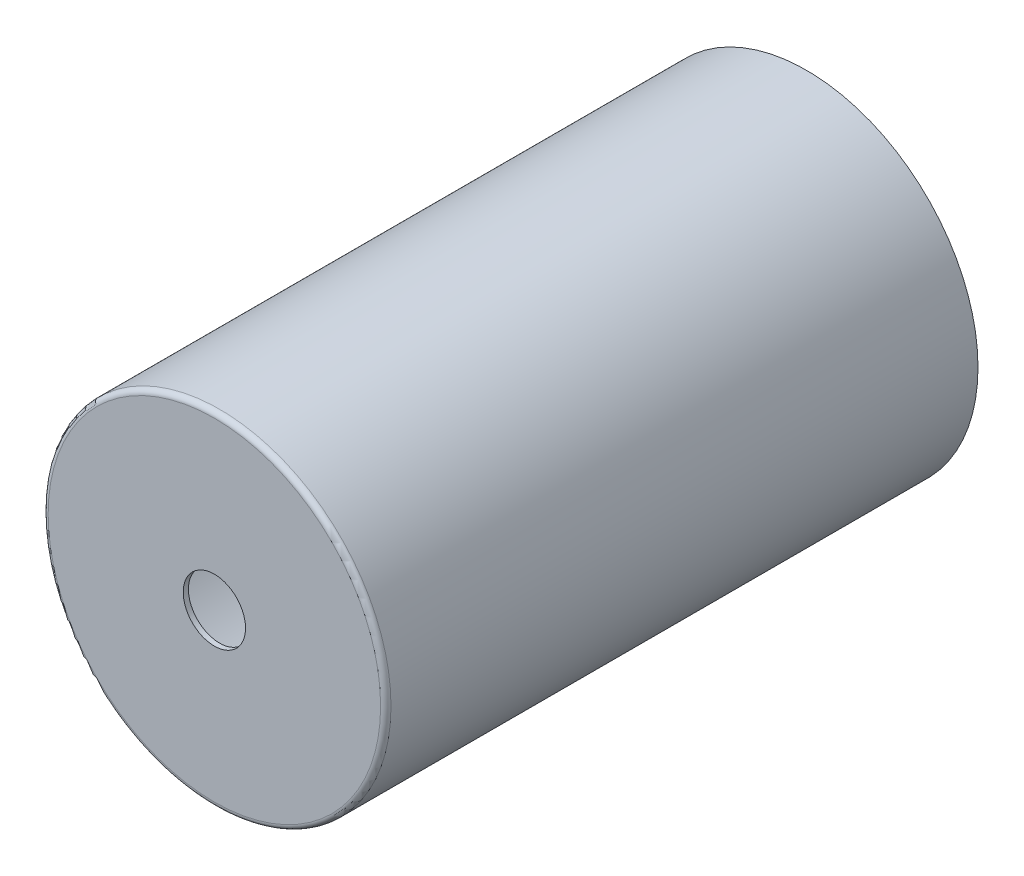
ISO-10303-21;
HEADER;
FILE_DESCRIPTION(('STEP AP214'),'2;1');
FILE_NAME('part.step','',(''),(''),'','','');
FILE_SCHEMA(('AUTOMOTIVE_DESIGN { 1 0 10303 214 1 1 1 1 }'));
ENDSEC;
DATA;
#1=APPLICATION_CONTEXT('core data for automotive mechanical design processes');
#2=APPLICATION_PROTOCOL_DEFINITION('international standard','automotive_design',2000,#1);
#3=PRODUCT_CONTEXT('',#1,'mechanical');
#4=PRODUCT('Part','Part','',(#3));
#5=PRODUCT_RELATED_PRODUCT_CATEGORY('part','',(#4));
#6=PRODUCT_DEFINITION_FORMATION('','',#4);
#7=PRODUCT_DEFINITION_CONTEXT('part definition',#1,'design');
#8=PRODUCT_DEFINITION('design','',#6,#7);
#9=PRODUCT_DEFINITION_SHAPE('','',#8);
#10=(LENGTH_UNIT() NAMED_UNIT(*) SI_UNIT(.MILLI.,.METRE.));
#11=(NAMED_UNIT(*) PLANE_ANGLE_UNIT() SI_UNIT($,.RADIAN.));
#12=(NAMED_UNIT(*) SI_UNIT($,.STERADIAN.) SOLID_ANGLE_UNIT());
#13=UNCERTAINTY_MEASURE_WITH_UNIT(LENGTH_MEASURE(1.E-05),#10,'distance_accuracy_value','');
#14=(GEOMETRIC_REPRESENTATION_CONTEXT(3) GLOBAL_UNCERTAINTY_ASSIGNED_CONTEXT((#13)) GLOBAL_UNIT_ASSIGNED_CONTEXT((#10,
#11,#12)) REPRESENTATION_CONTEXT('',''));
#15=CARTESIAN_POINT('',(0.,0.,0.));
#16=DIRECTION('',(0.,0.,1.));
#17=DIRECTION('',(1.,0.,0.));
#18=AXIS2_PLACEMENT_3D('',#15,#16,#17);
#19=CARTESIAN_POINT('',(0.,0.,-57.));
#20=DIRECTION('',(0.,0.,1.));
#21=DIRECTION('',(1.,0.,0.));
#22=AXIS2_PLACEMENT_3D('',#19,#20,#21);
#23=CYLINDRICAL_SURFACE('',#22,16.5);
#24=CARTESIAN_POINT('',(0.,0.,-0.5));
#25=DIRECTION('',(0.,0.,1.));
#26=DIRECTION('',(1.,0.,0.));
#27=AXIS2_PLACEMENT_3D('',#24,#25,#26);
#28=CIRCLE('',#27,16.5);
#29=CARTESIAN_POINT('',(16.5,0.,-0.5));
#30=VERTEX_POINT('',#29);
#31=EDGE_CURVE('E10',#30,#30,#28,.F.);
#32=CARTESIAN_POINT('',(0.,0.,-57.));
#33=DIRECTION('',(0.,0.,1.));
#34=DIRECTION('',(1.,0.,0.));
#35=AXIS2_PLACEMENT_3D('',#32,#33,#34);
#36=CIRCLE('',#35,16.5);
#37=CARTESIAN_POINT('',(16.5,0.,-57.));
#38=VERTEX_POINT('',#37);
#39=EDGE_CURVE('E42',#38,#38,#36,.T.);
#40=CARTESIAN_POINT('',(16.5,0.,-0.5));
#41=CARTESIAN_POINT('',(16.5,0.,-1.08854166666667));
#42=CARTESIAN_POINT('',(16.5,0.,-1.67708333333333));
#43=CARTESIAN_POINT('',(16.5,0.,-2.85416666666667));
#44=CARTESIAN_POINT('',(16.5,0.,-3.44270833333333));
#45=CARTESIAN_POINT('',(16.5,0.,-4.61979166666667));
#46=CARTESIAN_POINT('',(16.5,0.,-5.20833333333333));
#47=CARTESIAN_POINT('',(16.5,0.,-6.38541666666667));
#48=CARTESIAN_POINT('',(16.5,0.,-6.97395833333333));
#49=CARTESIAN_POINT('',(16.5,0.,-8.15104166666667));
#50=CARTESIAN_POINT('',(16.5,0.,-8.73958333333334));
#51=CARTESIAN_POINT('',(16.5,0.,-9.91666666666667));
#52=CARTESIAN_POINT('',(16.5,0.,-10.5052083333333));
#53=CARTESIAN_POINT('',(16.5,0.,-11.6822916666667));
#54=CARTESIAN_POINT('',(16.5,0.,-12.2708333333333));
#55=CARTESIAN_POINT('',(16.5,0.,-13.4479166666667));
#56=CARTESIAN_POINT('',(16.5,0.,-14.0364583333333));
#57=CARTESIAN_POINT('',(16.5,0.,-15.2135416666667));
#58=CARTESIAN_POINT('',(16.5,0.,-15.8020833333333));
#59=CARTESIAN_POINT('',(16.5,0.,-16.9791666666667));
#60=CARTESIAN_POINT('',(16.5,0.,-17.5677083333333));
#61=CARTESIAN_POINT('',(16.5,0.,-18.7447916666667));
#62=CARTESIAN_POINT('',(16.5,0.,-19.3333333333333));
#63=CARTESIAN_POINT('',(16.5,0.,-20.5104166666667));
#64=CARTESIAN_POINT('',(16.5,0.,-21.0989583333333));
#65=CARTESIAN_POINT('',(16.5,0.,-22.2760416666667));
#66=CARTESIAN_POINT('',(16.5,0.,-22.8645833333333));
#67=CARTESIAN_POINT('',(16.5,0.,-24.0416666666667));
#68=CARTESIAN_POINT('',(16.5,0.,-24.6302083333333));
#69=CARTESIAN_POINT('',(16.5,0.,-25.8072916666667));
#70=CARTESIAN_POINT('',(16.5,0.,-26.3958333333333));
#71=CARTESIAN_POINT('',(16.5,0.,-27.5729166666667));
#72=CARTESIAN_POINT('',(16.5,0.,-28.1614583333333));
#73=CARTESIAN_POINT('',(16.5,0.,-29.3385416666667));
#74=CARTESIAN_POINT('',(16.5,0.,-29.9270833333333));
#75=CARTESIAN_POINT('',(16.5,0.,-31.1041666666667));
#76=CARTESIAN_POINT('',(16.5,0.,-31.6927083333333));
#77=CARTESIAN_POINT('',(16.5,0.,-32.8697916666667));
#78=CARTESIAN_POINT('',(16.5,0.,-33.4583333333333));
#79=CARTESIAN_POINT('',(16.5,0.,-34.6354166666667));
#80=CARTESIAN_POINT('',(16.5,0.,-35.2239583333333));
#81=CARTESIAN_POINT('',(16.5,0.,-36.4010416666667));
#82=CARTESIAN_POINT('',(16.5,0.,-36.9895833333333));
#83=CARTESIAN_POINT('',(16.5,0.,-38.1666666666667));
#84=CARTESIAN_POINT('',(16.5,0.,-38.7552083333333));
#85=CARTESIAN_POINT('',(16.5,0.,-39.9322916666667));
#86=CARTESIAN_POINT('',(16.5,0.,-40.5208333333333));
#87=CARTESIAN_POINT('',(16.5,0.,-41.6979166666667));
#88=CARTESIAN_POINT('',(16.5,0.,-42.2864583333333));
#89=CARTESIAN_POINT('',(16.5,0.,-43.4635416666667));
#90=CARTESIAN_POINT('',(16.5,0.,-44.0520833333333));
#91=CARTESIAN_POINT('',(16.5,0.,-45.2291666666667));
#92=CARTESIAN_POINT('',(16.5,0.,-45.8177083333333));
#93=CARTESIAN_POINT('',(16.5,0.,-46.9947916666667));
#94=CARTESIAN_POINT('',(16.5,0.,-47.5833333333333));
#95=CARTESIAN_POINT('',(16.5,0.,-48.7604166666667));
#96=CARTESIAN_POINT('',(16.5,0.,-49.3489583333333));
#97=CARTESIAN_POINT('',(16.5,0.,-50.5260416666667));
#98=CARTESIAN_POINT('',(16.5,0.,-51.1145833333333));
#99=CARTESIAN_POINT('',(16.5,0.,-52.2916666666667));
#100=CARTESIAN_POINT('',(16.5,0.,-52.8802083333333));
#101=CARTESIAN_POINT('',(16.5,0.,-54.0572916666667));
#102=CARTESIAN_POINT('',(16.5,0.,-54.6458333333333));
#103=CARTESIAN_POINT('',(16.5,0.,-55.8229166666667));
#104=CARTESIAN_POINT('',(16.5,0.,-56.4114583333333));
#105=CARTESIAN_POINT('',(16.5,0.,-57.));
#106=B_SPLINE_CURVE_WITH_KNOTS('',3,(#40,#41,#42,#43,#44,#45,#46,#47,#48,#49,#50,#51,#52,#53,
#54,#55,#56,#57,#58,#59,#60,#61,#62,#63,#64,#65,#66,#67,#68,#69,#70,#71,#72,#73,#74,#75,#76,#77,
#78,#79,#80,#81,#82,#83,#84,#85,#86,#87,#88,#89,#90,#91,#92,#93,#94,#95,#96,#97,#98,#99,#100,
#101,#102,#103,#104,#105),.UNSPECIFIED.,.F.,.F.,(4,2,2,2,2,2,2,2,2,2,2,2,2,2,2,2,2,2,2,2,2,2,2,
2,2,2,2,2,2,2,2,2,4),(0.,1.765625,3.53125,5.296875,7.0625,8.82812500000001,10.59375,12.359375,
14.125,15.890625,17.65625,19.421875,21.1875,22.953125,24.71875,26.484375,28.25,30.015625,
31.78125,33.546875,35.3125,37.078125,38.84375,40.609375,42.375,44.140625,45.90625,47.671875,
49.4375,51.203125,52.96875,54.734375,56.5),.UNSPECIFIED.);
#107=EDGE_CURVE('BSEAM31',#30,#38,#106,.T.);
#108=ORIENTED_EDGE('',*,*,#31,.T.);
#109=ORIENTED_EDGE('',*,*,#39,.T.);
#110=ORIENTED_EDGE('',*,*,#107,.T.);
#111=ORIENTED_EDGE('',*,*,#107,.F.);
#112=EDGE_LOOP('',(#108,#110,#109,#111));
#113=FACE_BOUND('',#112,.T.);
#114=ADVANCED_FACE('F31',(#113),#23,.T.);
#115=CARTESIAN_POINT('',(0.,0.,-57.));
#116=DIRECTION('',(0.,0.,1.));
#117=DIRECTION('',(1.,0.,0.));
#118=AXIS2_PLACEMENT_3D('',#115,#116,#117);
#119=PLANE('',#118);
#120=CARTESIAN_POINT('',(0.,0.,-57.));
#121=DIRECTION('',(0.,0.,1.));
#122=DIRECTION('',(1.,0.,0.));
#123=AXIS2_PLACEMENT_3D('',#120,#121,#122);
#124=CIRCLE('',#123,16.);
#125=CARTESIAN_POINT('',(16.,0.,-57.));
#126=VERTEX_POINT('',#125);
#127=EDGE_CURVE('E46',#126,#126,#124,.T.);
#128=ORIENTED_EDGE('',*,*,#127,.T.);
#129=EDGE_LOOP('',(#128));
#130=FACE_BOUND('',#129,.T.);
#131=ORIENTED_EDGE('',*,*,#39,.F.);
#132=EDGE_LOOP('',(#131));
#133=FACE_BOUND('',#132,.T.);
#134=ADVANCED_FACE('F67',(#130,#133),#119,.F.);
#135=CARTESIAN_POINT('',(0.,0.,0.));
#136=DIRECTION('',(0.,0.,1.));
#137=DIRECTION('',(1.,0.,0.));
#138=AXIS2_PLACEMENT_3D('',#135,#136,#137);
#139=PLANE('',#138);
#140=CARTESIAN_POINT('',(0.,0.,0.));
#141=DIRECTION('',(0.,0.,1.));
#142=DIRECTION('',(1.,0.,0.));
#143=AXIS2_PLACEMENT_3D('',#140,#141,#142);
#144=CIRCLE('',#143,16.);
#145=CARTESIAN_POINT('',(16.,0.,0.));
#146=VERTEX_POINT('',#145);
#147=EDGE_CURVE('E38',#146,#146,#144,.T.);
#148=ORIENTED_EDGE('',*,*,#147,.T.);
#149=EDGE_LOOP('',(#148));
#150=FACE_BOUND('',#149,.T.);
#151=CARTESIAN_POINT('',(0.,0.,0.));
#152=DIRECTION('',(0.,0.,1.));
#153=DIRECTION('',(1.,0.,0.));
#154=AXIS2_PLACEMENT_3D('',#151,#152,#153);
#155=CIRCLE('',#154,3.);
#156=CARTESIAN_POINT('',(3.,0.,0.));
#157=VERTEX_POINT('',#156);
#158=EDGE_CURVE('E52',#157,#157,#155,.T.);
#159=ORIENTED_EDGE('',*,*,#158,.F.);
#160=EDGE_LOOP('',(#159));
#161=FACE_BOUND('',#160,.T.);
#162=ADVANCED_FACE('F64',(#150,#161),#139,.T.);
#163=CARTESIAN_POINT('',(0.,0.,-57.));
#164=DIRECTION('',(0.,0.,1.));
#165=DIRECTION('',(1.,0.,0.));
#166=AXIS2_PLACEMENT_3D('',#163,#164,#165);
#167=CYLINDRICAL_SURFACE('',#166,16.);
#168=CARTESIAN_POINT('',(0.,0.,-0.5));
#169=DIRECTION('',(0.,0.,1.));
#170=DIRECTION('',(1.,0.,0.));
#171=AXIS2_PLACEMENT_3D('',#168,#169,#170);
#172=CIRCLE('',#171,16.);
#173=CARTESIAN_POINT('',(16.,0.,-0.5));
#174=VERTEX_POINT('',#173);
#175=EDGE_CURVE('E51',#174,#174,#172,.T.);
#176=CARTESIAN_POINT('',(16.,0.,-57.));
#177=CARTESIAN_POINT('',(16.,0.,-56.4114583333333));
#178=CARTESIAN_POINT('',(16.,0.,-55.8229166666667));
#179=CARTESIAN_POINT('',(16.,0.,-54.6458333333333));
#180=CARTESIAN_POINT('',(16.,0.,-54.0572916666667));
#181=CARTESIAN_POINT('',(16.,0.,-52.8802083333333));
#182=CARTESIAN_POINT('',(16.,0.,-52.2916666666667));
#183=CARTESIAN_POINT('',(16.,0.,-51.1145833333333));
#184=CARTESIAN_POINT('',(16.,0.,-50.5260416666667));
#185=CARTESIAN_POINT('',(16.,0.,-49.3489583333333));
#186=CARTESIAN_POINT('',(16.,0.,-48.7604166666667));
#187=CARTESIAN_POINT('',(16.,0.,-47.5833333333333));
#188=CARTESIAN_POINT('',(16.,0.,-46.9947916666667));
#189=CARTESIAN_POINT('',(16.,0.,-45.8177083333333));
#190=CARTESIAN_POINT('',(16.,0.,-45.2291666666667));
#191=CARTESIAN_POINT('',(16.,0.,-44.0520833333333));
#192=CARTESIAN_POINT('',(16.,0.,-43.4635416666667));
#193=CARTESIAN_POINT('',(16.,0.,-42.2864583333333));
#194=CARTESIAN_POINT('',(16.,0.,-41.6979166666667));
#195=CARTESIAN_POINT('',(16.,0.,-40.5208333333333));
#196=CARTESIAN_POINT('',(16.,0.,-39.9322916666667));
#197=CARTESIAN_POINT('',(16.,0.,-38.7552083333333));
#198=CARTESIAN_POINT('',(16.,0.,-38.1666666666667));
#199=CARTESIAN_POINT('',(16.,0.,-36.9895833333333));
#200=CARTESIAN_POINT('',(16.,0.,-36.4010416666667));
#201=CARTESIAN_POINT('',(16.,0.,-35.2239583333333));
#202=CARTESIAN_POINT('',(16.,0.,-34.6354166666667));
#203=CARTESIAN_POINT('',(16.,0.,-33.4583333333333));
#204=CARTESIAN_POINT('',(16.,0.,-32.8697916666667));
#205=CARTESIAN_POINT('',(16.,0.,-31.6927083333333));
#206=CARTESIAN_POINT('',(16.,0.,-31.1041666666667));
#207=CARTESIAN_POINT('',(16.,0.,-29.9270833333333));
#208=CARTESIAN_POINT('',(16.,0.,-29.3385416666667));
#209=CARTESIAN_POINT('',(16.,0.,-28.1614583333333));
#210=CARTESIAN_POINT('',(16.,0.,-27.5729166666667));
#211=CARTESIAN_POINT('',(16.,0.,-26.3958333333333));
#212=CARTESIAN_POINT('',(16.,0.,-25.8072916666667));
#213=CARTESIAN_POINT('',(16.,0.,-24.6302083333333));
#214=CARTESIAN_POINT('',(16.,0.,-24.0416666666667));
#215=CARTESIAN_POINT('',(16.,0.,-22.8645833333333));
#216=CARTESIAN_POINT('',(16.,0.,-22.2760416666667));
#217=CARTESIAN_POINT('',(16.,0.,-21.0989583333333));
#218=CARTESIAN_POINT('',(16.,0.,-20.5104166666667));
#219=CARTESIAN_POINT('',(16.,0.,-19.3333333333333));
#220=CARTESIAN_POINT('',(16.,0.,-18.7447916666667));
#221=CARTESIAN_POINT('',(16.,0.,-17.5677083333333));
#222=CARTESIAN_POINT('',(16.,0.,-16.9791666666667));
#223=CARTESIAN_POINT('',(16.,0.,-15.8020833333333));
#224=CARTESIAN_POINT('',(16.,0.,-15.2135416666667));
#225=CARTESIAN_POINT('',(16.,0.,-14.0364583333333));
#226=CARTESIAN_POINT('',(16.,0.,-13.4479166666667));
#227=CARTESIAN_POINT('',(16.,0.,-12.2708333333333));
#228=CARTESIAN_POINT('',(16.,0.,-11.6822916666667));
#229=CARTESIAN_POINT('',(16.,0.,-10.5052083333333));
#230=CARTESIAN_POINT('',(16.,0.,-9.91666666666667));
#231=CARTESIAN_POINT('',(16.,0.,-8.73958333333333));
#232=CARTESIAN_POINT('',(16.,0.,-8.15104166666667));
#233=CARTESIAN_POINT('',(16.,0.,-6.97395833333333));
#234=CARTESIAN_POINT('',(16.,0.,-6.38541666666667));
#235=CARTESIAN_POINT('',(16.,0.,-5.20833333333333));
#236=CARTESIAN_POINT('',(16.,0.,-4.61979166666667));
#237=CARTESIAN_POINT('',(16.,0.,-3.44270833333333));
#238=CARTESIAN_POINT('',(16.,0.,-2.85416666666667));
#239=CARTESIAN_POINT('',(16.,0.,-1.67708333333333));
#240=CARTESIAN_POINT('',(16.,0.,-1.08854166666667));
#241=CARTESIAN_POINT('',(16.,0.,-0.5));
#242=B_SPLINE_CURVE_WITH_KNOTS('',3,(#176,#177,#178,#179,#180,#181,#182,#183,#184,#185,#186,
#187,#188,#189,#190,#191,#192,#193,#194,#195,#196,#197,#198,#199,#200,#201,#202,#203,#204,#205,
#206,#207,#208,#209,#210,#211,#212,#213,#214,#215,#216,#217,#218,#219,#220,#221,#222,#223,#224,
#225,#226,#227,#228,#229,#230,#231,#232,#233,#234,#235,#236,#237,#238,#239,#240,#241),
.UNSPECIFIED.,.F.,.F.,(4,2,2,2,2,2,2,2,2,2,2,2,2,2,2,2,2,2,2,2,2,2,2,2,2,2,2,2,2,2,2,2,4),(0.,
1.76562500000001,3.53125000000001,5.29687500000001,7.06250000000001,8.82812500000001,10.59375,
12.359375,14.125,15.890625,17.65625,19.421875,21.1875,22.953125,24.71875,26.484375,28.25,
30.015625,31.78125,33.546875,35.3125,37.078125,38.84375,40.609375,42.375,44.140625,45.90625,
47.671875,49.4375,51.203125,52.96875,54.734375,56.5),.UNSPECIFIED.);
#243=EDGE_CURVE('BSEAM66',#126,#174,#242,.T.);
#244=ORIENTED_EDGE('',*,*,#127,.F.);
#245=ORIENTED_EDGE('',*,*,#175,.T.);
#246=ORIENTED_EDGE('',*,*,#243,.T.);
#247=ORIENTED_EDGE('',*,*,#243,.F.);
#248=EDGE_LOOP('',(#244,#246,#245,#247));
#249=FACE_BOUND('',#248,.T.);
#250=ADVANCED_FACE('F66',(#249),#167,.F.);
#251=CARTESIAN_POINT('',(0.,0.,-0.5));
#252=DIRECTION('',(0.,0.,1.));
#253=DIRECTION('',(1.,0.,0.));
#254=AXIS2_PLACEMENT_3D('',#251,#252,#253);
#255=PLANE('',#254);
#256=CARTESIAN_POINT('',(0.,0.,-0.5));
#257=DIRECTION('',(0.,0.,1.));
#258=DIRECTION('',(1.,0.,0.));
#259=AXIS2_PLACEMENT_3D('',#256,#257,#258);
#260=CIRCLE('',#259,3.);
#261=CARTESIAN_POINT('',(3.,0.,-0.5));
#262=VERTEX_POINT('',#261);
#263=EDGE_CURVE('E49',#262,#262,#260,.T.);
#264=ORIENTED_EDGE('',*,*,#263,.T.);
#265=EDGE_LOOP('',(#264));
#266=FACE_BOUND('',#265,.T.);
#267=ORIENTED_EDGE('',*,*,#175,.F.);
#268=EDGE_LOOP('',(#267));
#269=FACE_BOUND('',#268,.T.);
#270=ADVANCED_FACE('F73',(#266,#269),#255,.F.);
#271=CARTESIAN_POINT('',(0.,0.,-57.));
#272=DIRECTION('',(0.,0.,1.));
#273=DIRECTION('',(1.,0.,0.));
#274=AXIS2_PLACEMENT_3D('',#271,#272,#273);
#275=CYLINDRICAL_SURFACE('',#274,3.);
#276=CARTESIAN_POINT('',(3.,0.,0.));
#277=CARTESIAN_POINT('',(3.,0.,-0.00520833333333276));
#278=CARTESIAN_POINT('',(3.,0.,-0.0104166666666655));
#279=CARTESIAN_POINT('',(3.,0.,-0.020833333333331));
#280=CARTESIAN_POINT('',(3.,0.,-0.0260416666666638));
#281=CARTESIAN_POINT('',(3.,0.,-0.0364583333333316));
#282=CARTESIAN_POINT('',(3.,0.,-0.0416666666666667));
#283=CARTESIAN_POINT('',(3.,0.,-0.0520833333333345));
#284=CARTESIAN_POINT('',(3.,0.,-0.0572916666666673));
#285=CARTESIAN_POINT('',(3.,0.,-0.0677083333333328));
#286=CARTESIAN_POINT('',(3.,0.,-0.0729166666666656));
#287=CARTESIAN_POINT('',(3.,0.,-0.0833333333333334));
#288=CARTESIAN_POINT('',(3.,0.,-0.0885416666666685));
#289=CARTESIAN_POINT('',(3.,0.,-0.0989583333333363));
#290=CARTESIAN_POINT('',(3.,0.,-0.104166666666669));
#291=CARTESIAN_POINT('',(3.,0.,-0.114583333333335));
#292=CARTESIAN_POINT('',(3.,0.,-0.119791666666667));
#293=CARTESIAN_POINT('',(3.,0.,-0.130208333333333));
#294=CARTESIAN_POINT('',(3.,0.,-0.135416666666666));
#295=CARTESIAN_POINT('',(3.,0.,-0.145833333333331));
#296=CARTESIAN_POINT('',(3.,0.,-0.151041666666664));
#297=CARTESIAN_POINT('',(3.,0.,-0.161458333333332));
#298=CARTESIAN_POINT('',(3.,0.,-0.166666666666667));
#299=CARTESIAN_POINT('',(3.,0.,-0.177083333333335));
#300=CARTESIAN_POINT('',(3.,0.,-0.182291666666667));
#301=CARTESIAN_POINT('',(3.,0.,-0.192708333333333));
#302=CARTESIAN_POINT('',(3.,0.,-0.197916666666666));
#303=CARTESIAN_POINT('',(3.,0.,-0.208333333333334));
#304=CARTESIAN_POINT('',(3.,0.,-0.213541666666669));
#305=CARTESIAN_POINT('',(3.,0.,-0.223958333333336));
#306=CARTESIAN_POINT('',(3.,0.,-0.229166666666669));
#307=CARTESIAN_POINT('',(3.,0.,-0.239583333333335));
#308=CARTESIAN_POINT('',(3.,0.,-0.244791666666667));
#309=CARTESIAN_POINT('',(3.,0.,-0.255208333333333));
#310=CARTESIAN_POINT('',(3.,0.,-0.260416666666666));
#311=CARTESIAN_POINT('',(3.,0.,-0.270833333333331));
#312=CARTESIAN_POINT('',(3.,0.,-0.276041666666664));
#313=CARTESIAN_POINT('',(3.,0.,-0.286458333333332));
#314=CARTESIAN_POINT('',(3.,0.,-0.291666666666667));
#315=CARTESIAN_POINT('',(3.,0.,-0.302083333333335));
#316=CARTESIAN_POINT('',(3.,0.,-0.307291666666668));
#317=CARTESIAN_POINT('',(3.,0.,-0.317708333333333));
#318=CARTESIAN_POINT('',(3.,0.,-0.322916666666666));
#319=CARTESIAN_POINT('',(3.,0.,-0.333333333333334));
#320=CARTESIAN_POINT('',(3.,0.,-0.338541666666669));
#321=CARTESIAN_POINT('',(3.,0.,-0.348958333333337));
#322=CARTESIAN_POINT('',(3.,0.,-0.354166666666669));
#323=CARTESIAN_POINT('',(3.,0.,-0.364583333333335));
#324=CARTESIAN_POINT('',(3.,0.,-0.369791666666668));
#325=CARTESIAN_POINT('',(3.,0.,-0.380208333333333));
#326=CARTESIAN_POINT('',(3.,0.,-0.385416666666666));
#327=CARTESIAN_POINT('',(3.,0.,-0.395833333333331));
#328=CARTESIAN_POINT('',(3.,0.,-0.401041666666664));
#329=CARTESIAN_POINT('',(3.,0.,-0.411458333333332));
#330=CARTESIAN_POINT('',(3.,0.,-0.416666666666667));
#331=CARTESIAN_POINT('',(3.,0.,-0.427083333333335));
#332=CARTESIAN_POINT('',(3.,0.,-0.432291666666668));
#333=CARTESIAN_POINT('',(3.,0.,-0.442708333333333));
#334=CARTESIAN_POINT('',(3.,0.,-0.447916666666666));
#335=CARTESIAN_POINT('',(3.,0.,-0.458333333333334));
#336=CARTESIAN_POINT('',(3.,0.,-0.463541666666669));
#337=CARTESIAN_POINT('',(3.,0.,-0.473958333333337));
#338=CARTESIAN_POINT('',(3.,0.,-0.479166666666669));
#339=CARTESIAN_POINT('',(3.,0.,-0.489583333333335));
#340=CARTESIAN_POINT('',(3.,0.,-0.494791666666668));
#341=CARTESIAN_POINT('',(3.,0.,-0.5));
#342=B_SPLINE_CURVE_WITH_KNOTS('',3,(#276,#277,#278,#279,#280,#281,#282,#283,#284,#285,#286,
#287,#288,#289,#290,#291,#292,#293,#294,#295,#296,#297,#298,#299,#300,#301,#302,#303,#304,#305,
#306,#307,#308,#309,#310,#311,#312,#313,#314,#315,#316,#317,#318,#319,#320,#321,#322,#323,#324,
#325,#326,#327,#328,#329,#330,#331,#332,#333,#334,#335,#336,#337,#338,#339,#340,#341),
.UNSPECIFIED.,.F.,.F.,(4,2,2,2,2,2,2,2,2,2,2,2,2,2,2,2,2,2,2,2,2,2,2,2,2,2,2,2,2,2,2,2,4),(0.,
0.0156249999999983,0.0312499999999966,0.0468750000000018,0.0625000000000001,0.0781249999999983,
0.0937500000000036,0.109375000000002,0.125,0.140624999999998,0.156249999999997,
0.171875000000002,0.1875,0.203124999999998,0.218750000000004,0.234375000000002,0.25,
0.265624999999999,0.281249999999997,0.296875000000002,0.3125,0.328124999999999,
0.343750000000004,0.359375000000002,0.375,0.390624999999999,0.406249999999997,0.421875000000002,
0.4375,0.453124999999999,0.468750000000004,0.484375000000002,0.5),.UNSPECIFIED.);
#343=EDGE_CURVE('BSEAM61',#157,#262,#342,.T.);
#344=ORIENTED_EDGE('',*,*,#158,.T.);
#345=ORIENTED_EDGE('',*,*,#263,.F.);
#346=ORIENTED_EDGE('',*,*,#343,.T.);
#347=ORIENTED_EDGE('',*,*,#343,.F.);
#348=EDGE_LOOP('',(#344,#346,#345,#347));
#349=FACE_BOUND('',#348,.T.);
#350=ADVANCED_FACE('F61',(#349),#275,.F.);
#351=CARTESIAN_POINT('',(0.,0.,-0.5));
#352=DIRECTION('',(0.,0.,1.));
#353=DIRECTION('',(1.,0.,0.));
#354=AXIS2_PLACEMENT_3D('',#351,#352,#353);
#355=TOROIDAL_SURFACE('',#354,16.,0.5);
#356=ORIENTED_EDGE('',*,*,#31,.F.);
#357=EDGE_LOOP('',(#356));
#358=FACE_BOUND('',#357,.T.);
#359=ORIENTED_EDGE('',*,*,#147,.F.);
#360=EDGE_LOOP('',(#359));
#361=FACE_BOUND('',#360,.T.);
#362=ADVANCED_FACE('F33',(#358,#361),#355,.T.);
#363=CLOSED_SHELL('',(#114,#134,#162,#250,#270,#350,#362));
#364=MANIFOLD_SOLID_BREP('B2',#363);
#365=ADVANCED_BREP_SHAPE_REPRESENTATION('',(#18,#364),#14);
#366=SHAPE_DEFINITION_REPRESENTATION(#9,#365);
ENDSEC;
END-ISO-10303-21;
